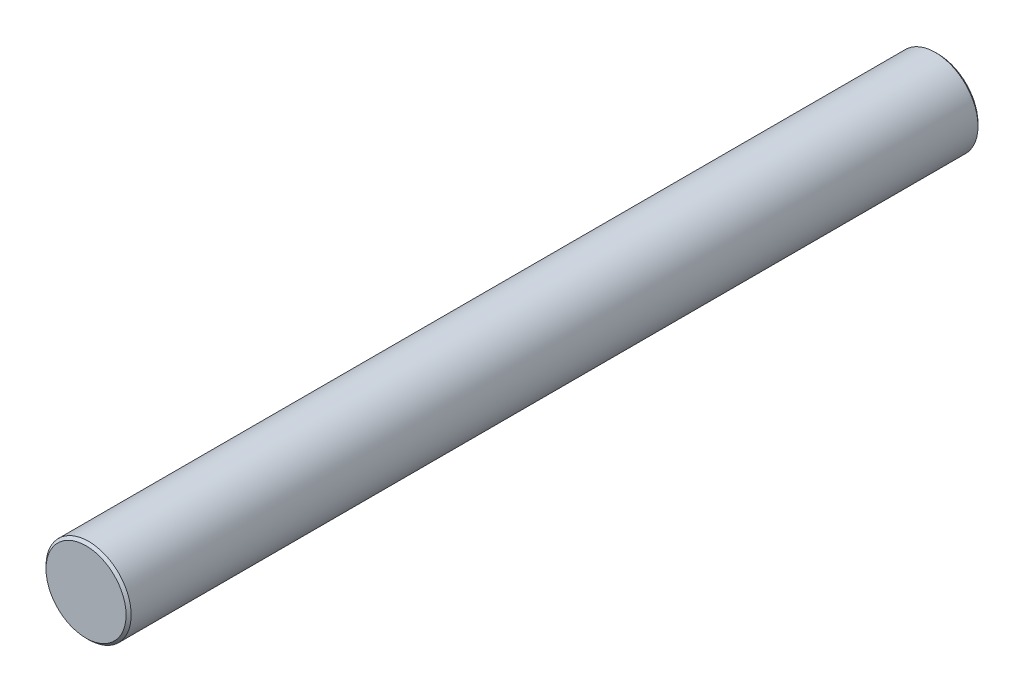
ISO-10303-21;
HEADER;
FILE_DESCRIPTION(('STEP AP214'),'2;1');
FILE_NAME('part.step','',(''),(''),'','','');
FILE_SCHEMA(('AUTOMOTIVE_DESIGN { 1 0 10303 214 1 1 1 1 }'));
ENDSEC;
DATA;
#1=APPLICATION_CONTEXT('core data for automotive mechanical design processes');
#2=APPLICATION_PROTOCOL_DEFINITION('international standard','automotive_design',2000,#1);
#3=PRODUCT_CONTEXT('',#1,'mechanical');
#4=PRODUCT('Part','Part','',(#3));
#5=PRODUCT_RELATED_PRODUCT_CATEGORY('part','',(#4));
#6=PRODUCT_DEFINITION_FORMATION('','',#4);
#7=PRODUCT_DEFINITION_CONTEXT('part definition',#1,'design');
#8=PRODUCT_DEFINITION('design','',#6,#7);
#9=PRODUCT_DEFINITION_SHAPE('','',#8);
#10=(LENGTH_UNIT() NAMED_UNIT(*) SI_UNIT(.MILLI.,.METRE.));
#11=(NAMED_UNIT(*) PLANE_ANGLE_UNIT() SI_UNIT($,.RADIAN.));
#12=(NAMED_UNIT(*) SI_UNIT($,.STERADIAN.) SOLID_ANGLE_UNIT());
#13=UNCERTAINTY_MEASURE_WITH_UNIT(LENGTH_MEASURE(1.E-05),#10,'distance_accuracy_value','');
#14=(GEOMETRIC_REPRESENTATION_CONTEXT(3) GLOBAL_UNCERTAINTY_ASSIGNED_CONTEXT((#13)) GLOBAL_UNIT_ASSIGNED_CONTEXT((#10,
#11,#12)) REPRESENTATION_CONTEXT('',''));
#15=CARTESIAN_POINT('',(0.,0.,0.));
#16=DIRECTION('',(0.,0.,1.));
#17=DIRECTION('',(1.,0.,0.));
#18=AXIS2_PLACEMENT_3D('',#15,#16,#17);
#19=CARTESIAN_POINT('',(0.,0.,50.));
#20=DIRECTION('',(0.,0.,-1.));
#21=DIRECTION('',(-1.,0.,0.));
#22=AXIS2_PLACEMENT_3D('',#19,#20,#21);
#23=CYLINDRICAL_SURFACE('',#22,5.);
#24=CARTESIAN_POINT('',(0.,0.,-49.6999999999999));
#25=DIRECTION('',(0.,0.,1.));
#26=DIRECTION('',(1.,0.,0.));
#27=AXIS2_PLACEMENT_3D('',#24,#25,#26);
#28=CIRCLE('',#27,5.);
#29=CARTESIAN_POINT('',(-5.,0.,-49.6999999999999));
#30=VERTEX_POINT('',#29);
#31=EDGE_CURVE('E52',#30,#30,#28,.T.);
#32=CARTESIAN_POINT('',(0.,0.,49.7));
#33=DIRECTION('',(0.,0.,1.));
#34=DIRECTION('',(1.,0.,0.));
#35=AXIS2_PLACEMENT_3D('',#32,#33,#34);
#36=CIRCLE('',#35,5.);
#37=CARTESIAN_POINT('',(-5.,0.,49.7));
#38=VERTEX_POINT('',#37);
#39=EDGE_CURVE('E57',#38,#38,#36,.F.);
#40=CARTESIAN_POINT('',(-5.,0.,-49.6999999999999));
#41=CARTESIAN_POINT('',(-5.,0.,-48.6645833333332));
#42=CARTESIAN_POINT('',(-5.,0.,-47.6291666666666));
#43=CARTESIAN_POINT('',(-5.,0.,-45.5583333333333));
#44=CARTESIAN_POINT('',(-5.,0.,-44.5229166666666));
#45=CARTESIAN_POINT('',(-5.,0.,-42.4520833333332));
#46=CARTESIAN_POINT('',(-5.,0.,-41.4166666666666));
#47=CARTESIAN_POINT('',(-5.,0.,-39.3458333333333));
#48=CARTESIAN_POINT('',(-5.,0.,-38.3104166666666));
#49=CARTESIAN_POINT('',(-5.,0.,-36.2395833333333));
#50=CARTESIAN_POINT('',(-5.,0.,-35.2041666666666));
#51=CARTESIAN_POINT('',(-5.,0.,-33.1333333333332));
#52=CARTESIAN_POINT('',(-5.,0.,-32.0979166666666));
#53=CARTESIAN_POINT('',(-5.,0.,-30.0270833333333));
#54=CARTESIAN_POINT('',(-5.,0.,-28.9916666666666));
#55=CARTESIAN_POINT('',(-5.,0.,-26.9208333333333));
#56=CARTESIAN_POINT('',(-5.,0.,-25.8854166666666));
#57=CARTESIAN_POINT('',(-5.,0.,-23.8145833333333));
#58=CARTESIAN_POINT('',(-5.,0.,-22.7791666666666));
#59=CARTESIAN_POINT('',(-5.,0.,-20.7083333333333));
#60=CARTESIAN_POINT('',(-5.,0.,-19.6729166666666));
#61=CARTESIAN_POINT('',(-5.,0.,-17.6020833333333));
#62=CARTESIAN_POINT('',(-5.,0.,-16.5666666666666));
#63=CARTESIAN_POINT('',(-5.,0.,-14.4958333333333));
#64=CARTESIAN_POINT('',(-5.,0.,-13.4604166666666));
#65=CARTESIAN_POINT('',(-5.,0.,-11.3895833333333));
#66=CARTESIAN_POINT('',(-5.,0.,-10.3541666666666));
#67=CARTESIAN_POINT('',(-5.,0.,-8.28333333333327));
#68=CARTESIAN_POINT('',(-5.,0.,-7.24791666666661));
#69=CARTESIAN_POINT('',(-5.,0.,-5.17708333333327));
#70=CARTESIAN_POINT('',(-5.,0.,-4.14166666666661));
#71=CARTESIAN_POINT('',(-5.,0.,-2.07083333333328));
#72=CARTESIAN_POINT('',(-5.,0.,-1.03541666666661));
#73=CARTESIAN_POINT('',(-5.,0.,1.03541666666672));
#74=CARTESIAN_POINT('',(-5.,0.,2.07083333333339));
#75=CARTESIAN_POINT('',(-5.,0.,4.14166666666672));
#76=CARTESIAN_POINT('',(-5.,0.,5.17708333333339));
#77=CARTESIAN_POINT('',(-5.,0.,7.24791666666672));
#78=CARTESIAN_POINT('',(-5.,0.,8.28333333333338));
#79=CARTESIAN_POINT('',(-5.,0.,10.3541666666667));
#80=CARTESIAN_POINT('',(-5.,0.,11.3895833333334));
#81=CARTESIAN_POINT('',(-5.,0.,13.4604166666667));
#82=CARTESIAN_POINT('',(-5.,0.,14.4958333333334));
#83=CARTESIAN_POINT('',(-5.,0.,16.5666666666667));
#84=CARTESIAN_POINT('',(-5.,0.,17.6020833333334));
#85=CARTESIAN_POINT('',(-5.,0.,19.6729166666667));
#86=CARTESIAN_POINT('',(-5.,0.,20.7083333333334));
#87=CARTESIAN_POINT('',(-5.,0.,22.7791666666667));
#88=CARTESIAN_POINT('',(-5.,0.,23.8145833333334));
#89=CARTESIAN_POINT('',(-5.,0.,25.8854166666667));
#90=CARTESIAN_POINT('',(-5.,0.,26.9208333333334));
#91=CARTESIAN_POINT('',(-5.,0.,28.9916666666667));
#92=CARTESIAN_POINT('',(-5.,0.,30.0270833333334));
#93=CARTESIAN_POINT('',(-5.,0.,32.0979166666667));
#94=CARTESIAN_POINT('',(-5.,0.,33.1333333333334));
#95=CARTESIAN_POINT('',(-5.,0.,35.2041666666667));
#96=CARTESIAN_POINT('',(-5.,0.,36.2395833333334));
#97=CARTESIAN_POINT('',(-5.,0.,38.3104166666667));
#98=CARTESIAN_POINT('',(-5.,0.,39.3458333333334));
#99=CARTESIAN_POINT('',(-5.,0.,41.4166666666667));
#100=CARTESIAN_POINT('',(-5.,0.,42.4520833333334));
#101=CARTESIAN_POINT('',(-5.,0.,44.5229166666667));
#102=CARTESIAN_POINT('',(-5.,0.,45.5583333333334));
#103=CARTESIAN_POINT('',(-5.,0.,47.6291666666667));
#104=CARTESIAN_POINT('',(-5.,0.,48.6645833333334));
#105=CARTESIAN_POINT('',(-5.,0.,49.7));
#106=B_SPLINE_CURVE_WITH_KNOTS('',3,(#40,#41,#42,#43,#44,#45,#46,#47,#48,#49,#50,#51,#52,#53,
#54,#55,#56,#57,#58,#59,#60,#61,#62,#63,#64,#65,#66,#67,#68,#69,#70,#71,#72,#73,#74,#75,#76,#77,
#78,#79,#80,#81,#82,#83,#84,#85,#86,#87,#88,#89,#90,#91,#92,#93,#94,#95,#96,#97,#98,#99,#100,
#101,#102,#103,#104,#105),.UNSPECIFIED.,.F.,.F.,(4,2,2,2,2,2,2,2,2,2,2,2,2,2,2,2,2,2,2,2,2,2,2,
2,2,2,2,2,2,2,2,2,4),(0.,3.10625,6.2125,9.31875,12.425,15.53125,18.6375,21.74375,24.85,27.95625,
31.0625,34.16875,37.275,40.38125,43.4875,46.59375,49.7,52.80625,55.9125,59.01875,62.125,
65.23125,68.3374999999999,71.44375,74.55,77.65625,80.7625,83.8687499999999,86.9749999999999,
90.0812499999999,93.1874999999999,96.2937499999999,99.3999999999999),.UNSPECIFIED.);
#107=EDGE_CURVE('BSEAM39',#30,#38,#106,.T.);
#108=ORIENTED_EDGE('',*,*,#31,.T.);
#109=ORIENTED_EDGE('',*,*,#39,.T.);
#110=ORIENTED_EDGE('',*,*,#107,.T.);
#111=ORIENTED_EDGE('',*,*,#107,.F.);
#112=EDGE_LOOP('',(#108,#110,#109,#111));
#113=FACE_BOUND('',#112,.T.);
#114=ADVANCED_FACE('F39',(#113),#23,.T.);
#115=CARTESIAN_POINT('',(0.,0.,50.));
#116=DIRECTION('',(0.,0.,1.));
#117=DIRECTION('',(1.,0.,0.));
#118=AXIS2_PLACEMENT_3D('',#115,#116,#117);
#119=PLANE('',#118);
#120=CARTESIAN_POINT('',(0.,0.,50.));
#121=DIRECTION('',(0.,0.,1.));
#122=DIRECTION('',(1.,0.,0.));
#123=AXIS2_PLACEMENT_3D('',#120,#121,#122);
#124=CIRCLE('',#123,4.70000000000004);
#125=CARTESIAN_POINT('',(4.70000000000004,0.,50.));
#126=VERTEX_POINT('',#125);
#127=EDGE_CURVE('E10',#126,#126,#124,.T.);
#128=ORIENTED_EDGE('',*,*,#127,.T.);
#129=EDGE_LOOP('',(#128));
#130=FACE_BOUND('',#129,.T.);
#131=ADVANCED_FACE('F74',(#130),#119,.T.);
#132=CARTESIAN_POINT('',(0.,0.,-50.));
#133=DIRECTION('',(0.,0.,1.));
#134=DIRECTION('',(1.,0.,0.));
#135=AXIS2_PLACEMENT_3D('',#132,#133,#134);
#136=PLANE('',#135);
#137=CARTESIAN_POINT('',(0.,0.,-50.));
#138=DIRECTION('',(0.,0.,1.));
#139=DIRECTION('',(1.,0.,0.));
#140=AXIS2_PLACEMENT_3D('',#137,#138,#139);
#141=CIRCLE('',#140,4.69999999999993);
#142=CARTESIAN_POINT('',(4.69999999999993,0.,-50.));
#143=VERTEX_POINT('',#142);
#144=EDGE_CURVE('E47',#143,#143,#141,.F.);
#145=ORIENTED_EDGE('',*,*,#144,.T.);
#146=EDGE_LOOP('',(#145));
#147=FACE_BOUND('',#146,.T.);
#148=ADVANCED_FACE('F71',(#147),#136,.F.);
#149=CARTESIAN_POINT('',(0.,0.,-49.6999999999999));
#150=DIRECTION('',(0.,0.,1.));
#151=DIRECTION('',(1.,0.,0.));
#152=AXIS2_PLACEMENT_3D('',#149,#150,#151);
#153=CONICAL_SURFACE('',#152,5.,0.785398163397441);
#154=ORIENTED_EDGE('',*,*,#144,.F.);
#155=EDGE_LOOP('',(#154));
#156=FACE_BOUND('',#155,.T.);
#157=ORIENTED_EDGE('',*,*,#31,.F.);
#158=EDGE_LOOP('',(#157));
#159=FACE_BOUND('',#158,.T.);
#160=ADVANCED_FACE('F67',(#156,#159),#153,.T.);
#161=CARTESIAN_POINT('',(0.,0.,50.));
#162=DIRECTION('',(0.,0.,-1.));
#163=DIRECTION('',(-1.,0.,0.));
#164=AXIS2_PLACEMENT_3D('',#161,#162,#163);
#165=CONICAL_SURFACE('',#164,4.70000000000004,0.785398163397453);
#166=ORIENTED_EDGE('',*,*,#39,.F.);
#167=EDGE_LOOP('',(#166));
#168=FACE_BOUND('',#167,.T.);
#169=ORIENTED_EDGE('',*,*,#127,.F.);
#170=EDGE_LOOP('',(#169));
#171=FACE_BOUND('',#170,.T.);
#172=ADVANCED_FACE('F41',(#168,#171),#165,.T.);
#173=CLOSED_SHELL('',(#114,#131,#148,#160,#172));
#174=MANIFOLD_SOLID_BREP('B2',#173);
#175=ADVANCED_BREP_SHAPE_REPRESENTATION('',(#18,#174),#14);
#176=SHAPE_DEFINITION_REPRESENTATION(#9,#175);
ENDSEC;
END-ISO-10303-21;
